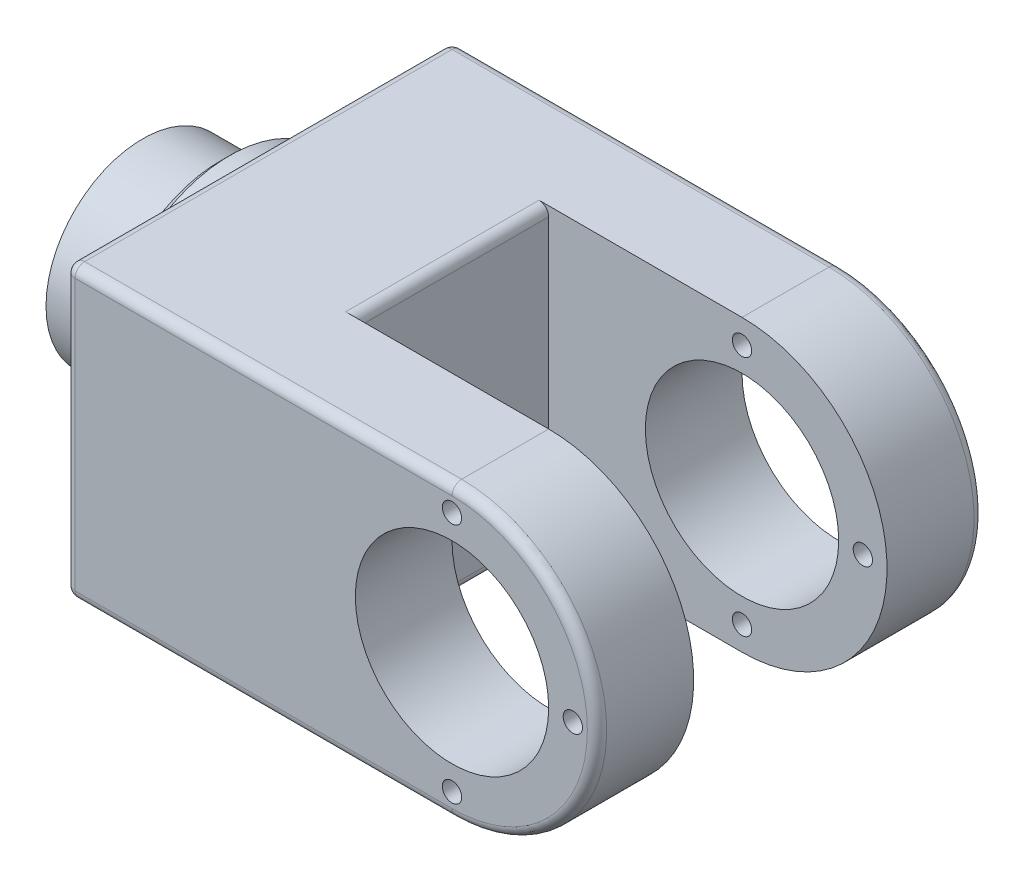
ISO-10303-21;
HEADER;
FILE_DESCRIPTION(('STEP AP214'),'2;1');
FILE_NAME('part.step','',(''),(''),'','','');
FILE_SCHEMA(('AUTOMOTIVE_DESIGN { 1 0 10303 214 1 1 1 1 }'));
ENDSEC;
DATA;
#1=APPLICATION_CONTEXT('core data for automotive mechanical design processes');
#2=APPLICATION_PROTOCOL_DEFINITION('international standard','automotive_design',2000,#1);
#3=PRODUCT_CONTEXT('',#1,'mechanical');
#4=PRODUCT('Part','Part','',(#3));
#5=PRODUCT_RELATED_PRODUCT_CATEGORY('part','',(#4));
#6=PRODUCT_DEFINITION_FORMATION('','',#4);
#7=PRODUCT_DEFINITION_CONTEXT('part definition',#1,'design');
#8=PRODUCT_DEFINITION('design','',#6,#7);
#9=PRODUCT_DEFINITION_SHAPE('','',#8);
#10=(LENGTH_UNIT() NAMED_UNIT(*) SI_UNIT(.MILLI.,.METRE.));
#11=(NAMED_UNIT(*) PLANE_ANGLE_UNIT() SI_UNIT($,.RADIAN.));
#12=(NAMED_UNIT(*) SI_UNIT($,.STERADIAN.) SOLID_ANGLE_UNIT());
#13=UNCERTAINTY_MEASURE_WITH_UNIT(LENGTH_MEASURE(1.E-05),#10,'distance_accuracy_value','');
#14=(GEOMETRIC_REPRESENTATION_CONTEXT(3) GLOBAL_UNCERTAINTY_ASSIGNED_CONTEXT((#13)) GLOBAL_UNIT_ASSIGNED_CONTEXT((#10,
#11,#12)) REPRESENTATION_CONTEXT('',''));
#15=CARTESIAN_POINT('',(0.,0.,0.));
#16=DIRECTION('',(0.,0.,1.));
#17=DIRECTION('',(1.,0.,0.));
#18=AXIS2_PLACEMENT_3D('',#15,#16,#17);
#19=CARTESIAN_POINT('',(-200.,75.,100.));
#20=DIRECTION('',(1.,0.,0.));
#21=DIRECTION('',(0.,0.,-1.));
#22=AXIS2_PLACEMENT_3D('',#19,#20,#21);
#23=PLANE('',#22);
#24=CARTESIAN_POINT('',(-200.,0.,0.));
#25=DIRECTION('',(1.,0.,0.));
#26=DIRECTION('',(0.,0.,-1.));
#27=AXIS2_PLACEMENT_3D('',#24,#25,#26);
#28=CIRCLE('',#27,70.);
#29=CARTESIAN_POINT('',(-200.,-70.,0.));
#30=VERTEX_POINT('',#29);
#31=CARTESIAN_POINT('',(-200.,0.,-70.));
#32=VERTEX_POINT('',#31);
#33=EDGE_CURVE('E264',#30,#32,#28,.T.);
#34=ORIENTED_EDGE('',*,*,#33,.T.);
#35=CARTESIAN_POINT('',(-200.,0.,0.));
#36=DIRECTION('',(1.,0.,0.));
#37=DIRECTION('',(0.,0.,-1.));
#38=AXIS2_PLACEMENT_3D('',#35,#36,#37);
#39=CIRCLE('',#38,70.);
#40=CARTESIAN_POINT('',(-200.,70.,0.));
#41=VERTEX_POINT('',#40);
#42=EDGE_CURVE('E266',#32,#41,#39,.T.);
#43=ORIENTED_EDGE('',*,*,#42,.T.);
#44=DIRECTION('',(0.,0.,-1.));
#45=VECTOR('',#44,1.);
#46=CARTESIAN_POINT('',(-200.,70.,100.));
#47=LINE('',#46,#45);
#48=CARTESIAN_POINT('',(-200.,70.,-95.));
#49=VERTEX_POINT('',#48);
#50=EDGE_CURVE('E262',#41,#49,#47,.T.);
#51=ORIENTED_EDGE('',*,*,#50,.T.);
#52=DIRECTION('',(0.,-1.,0.));
#53=VECTOR('',#52,1.);
#54=CARTESIAN_POINT('',(-200.,75.,-95.));
#55=LINE('',#54,#53);
#56=CARTESIAN_POINT('',(-200.,-70.,-95.));
#57=VERTEX_POINT('',#56);
#58=EDGE_CURVE('E260',#49,#57,#55,.T.);
#59=ORIENTED_EDGE('',*,*,#58,.T.);
#60=DIRECTION('',(0.,0.,-1.));
#61=VECTOR('',#60,1.);
#62=CARTESIAN_POINT('',(-200.,-70.,100.));
#63=LINE('',#62,#61);
#64=EDGE_CURVE('E254',#57,#30,#63,.F.);
#65=ORIENTED_EDGE('',*,*,#64,.T.);
#66=EDGE_LOOP('',(#34,#43,#51,#59,#65));
#67=FACE_BOUND('',#66,.T.);
#68=ADVANCED_FACE('F34',(#67),#23,.F.);
#69=CARTESIAN_POINT('',(0.,0.,100.));
#70=DIRECTION('',(0.,0.,-1.));
#71=DIRECTION('',(-1.,0.,0.));
#72=AXIS2_PLACEMENT_3D('',#69,#70,#71);
#73=CYLINDRICAL_SURFACE('',#72,75.);
#74=DIRECTION('',(0.,0.,-1.));
#75=VECTOR('',#74,1.);
#76=CARTESIAN_POINT('',(0.,-75.,100.));
#77=LINE('',#76,#75);
#78=CARTESIAN_POINT('',(0.,-75.,-50.));
#79=VERTEX_POINT('',#78);
#80=CARTESIAN_POINT('',(0.,-75.,-95.));
#81=VERTEX_POINT('',#80);
#82=EDGE_CURVE('E184',#79,#81,#77,.T.);
#83=ORIENTED_EDGE('',*,*,#82,.T.);
#84=CARTESIAN_POINT('',(0.,0.,-95.));
#85=DIRECTION('',(0.,0.,1.));
#86=DIRECTION('',(1.,0.,0.));
#87=AXIS2_PLACEMENT_3D('',#84,#85,#86);
#88=CIRCLE('',#87,75.);
#89=CARTESIAN_POINT('',(0.,75.,-95.));
#90=VERTEX_POINT('',#89);
#91=EDGE_CURVE('E179',#81,#90,#88,.T.);
#92=ORIENTED_EDGE('',*,*,#91,.T.);
#93=DIRECTION('',(0.,0.,-1.));
#94=VECTOR('',#93,1.);
#95=CARTESIAN_POINT('',(0.,75.,100.));
#96=LINE('',#95,#94);
#97=CARTESIAN_POINT('',(0.,75.,-50.));
#98=VERTEX_POINT('',#97);
#99=EDGE_CURVE('E171',#98,#90,#96,.T.);
#100=ORIENTED_EDGE('',*,*,#99,.F.);
#101=CARTESIAN_POINT('',(0.,0.,-50.));
#102=DIRECTION('',(0.,0.,1.));
#103=DIRECTION('',(1.,0.,0.));
#104=AXIS2_PLACEMENT_3D('',#101,#102,#103);
#105=CIRCLE('',#104,75.);
#106=EDGE_CURVE('E155',#79,#98,#105,.T.);
#107=ORIENTED_EDGE('',*,*,#106,.F.);
#108=EDGE_LOOP('',(#83,#92,#100,#107));
#109=FACE_BOUND('',#108,.T.);
#110=ADVANCED_FACE('F177',(#109),#73,.T.);
#111=CARTESIAN_POINT('',(0.,75.,100.));
#112=DIRECTION('',(0.,-1.,0.));
#113=DIRECTION('',(1.,0.,0.));
#114=AXIS2_PLACEMENT_3D('',#111,#112,#113);
#115=PLANE('',#114);
#116=DIRECTION('',(-1.,0.,0.));
#117=VECTOR('',#116,1.);
#118=CARTESIAN_POINT('',(0.,75.,50.));
#119=LINE('',#118,#117);
#120=CARTESIAN_POINT('',(0.,75.,50.));
#121=VERTEX_POINT('',#120);
#122=CARTESIAN_POINT('',(-105.,75.,50.));
#123=VERTEX_POINT('',#122);
#124=EDGE_CURVE('E364',#121,#123,#119,.T.);
#125=ORIENTED_EDGE('',*,*,#124,.T.);
#126=DIRECTION('',(0.,0.,1.));
#127=VECTOR('',#126,1.);
#128=CARTESIAN_POINT('',(-105.,75.,100.));
#129=LINE('',#128,#127);
#130=CARTESIAN_POINT('',(-105.,75.,-50.));
#131=VERTEX_POINT('',#130);
#132=EDGE_CURVE('E174',#123,#131,#129,.F.);
#133=ORIENTED_EDGE('',*,*,#132,.T.);
#134=DIRECTION('',(-1.,0.,0.));
#135=VECTOR('',#134,1.);
#136=CARTESIAN_POINT('',(0.,75.,-50.));
#137=LINE('',#136,#135);
#138=EDGE_CURVE('E158',#98,#131,#137,.T.);
#139=ORIENTED_EDGE('',*,*,#138,.F.);
#140=ORIENTED_EDGE('',*,*,#99,.T.);
#141=DIRECTION('',(-1.,0.,0.));
#142=VECTOR('',#141,1.);
#143=CARTESIAN_POINT('',(0.,75.,-95.));
#144=LINE('',#143,#142);
#145=CARTESIAN_POINT('',(-195.,75.,-95.));
#146=VERTEX_POINT('',#145);
#147=EDGE_CURVE('E273',#90,#146,#144,.T.);
#148=ORIENTED_EDGE('',*,*,#147,.T.);
#149=DIRECTION('',(0.,0.,-1.));
#150=VECTOR('',#149,1.);
#151=CARTESIAN_POINT('',(-195.,75.,100.));
#152=LINE('',#151,#150);
#153=CARTESIAN_POINT('',(-195.,75.,95.));
#154=VERTEX_POINT('',#153);
#155=EDGE_CURVE('E271',#146,#154,#152,.F.);
#156=ORIENTED_EDGE('',*,*,#155,.T.);
#157=DIRECTION('',(-1.,0.,0.));
#158=VECTOR('',#157,1.);
#159=CARTESIAN_POINT('',(0.,75.,95.));
#160=LINE('',#159,#158);
#161=CARTESIAN_POINT('',(0.,75.,95.));
#162=VERTEX_POINT('',#161);
#163=EDGE_CURVE('E269',#154,#162,#160,.F.);
#164=ORIENTED_EDGE('',*,*,#163,.T.);
#165=EDGE_CURVE('E180',#162,#121,#96,.T.);
#166=ORIENTED_EDGE('',*,*,#165,.T.);
#167=EDGE_LOOP('',(#125,#133,#139,#140,#148,#156,#164,#166));
#168=FACE_BOUND('',#167,.T.);
#169=ADVANCED_FACE('F170',(#168),#115,.F.);
#170=CARTESIAN_POINT('',(-200.,-75.,100.));
#171=DIRECTION('',(0.,1.,0.));
#172=DIRECTION('',(0.,0.,1.));
#173=AXIS2_PLACEMENT_3D('',#170,#171,#172);
#174=PLANE('',#173);
#175=DIRECTION('',(0.,0.,-1.));
#176=VECTOR('',#175,1.);
#177=CARTESIAN_POINT('',(-195.,-75.,100.));
#178=LINE('',#177,#176);
#179=CARTESIAN_POINT('',(-195.,-75.,95.));
#180=VERTEX_POINT('',#179);
#181=CARTESIAN_POINT('',(-195.,-75.,-95.));
#182=VERTEX_POINT('',#181);
#183=EDGE_CURVE('E210',#180,#182,#178,.T.);
#184=ORIENTED_EDGE('',*,*,#183,.T.);
#185=DIRECTION('',(1.,0.,0.));
#186=VECTOR('',#185,1.);
#187=CARTESIAN_POINT('',(-200.,-75.,-95.));
#188=LINE('',#187,#186);
#189=EDGE_CURVE('E214',#182,#81,#188,.T.);
#190=ORIENTED_EDGE('',*,*,#189,.T.);
#191=ORIENTED_EDGE('',*,*,#82,.F.);
#192=DIRECTION('',(1.,0.,0.));
#193=VECTOR('',#192,1.);
#194=CARTESIAN_POINT('',(-100.,-75.,-50.));
#195=LINE('',#194,#193);
#196=CARTESIAN_POINT('',(-105.,-75.,-50.));
#197=VERTEX_POINT('',#196);
#198=EDGE_CURVE('E161',#197,#79,#195,.T.);
#199=ORIENTED_EDGE('',*,*,#198,.F.);
#200=DIRECTION('',(0.,0.,1.));
#201=VECTOR('',#200,1.);
#202=CARTESIAN_POINT('',(-105.,-75.,100.));
#203=LINE('',#202,#201);
#204=CARTESIAN_POINT('',(-105.,-75.,50.));
#205=VERTEX_POINT('',#204);
#206=EDGE_CURVE('E193',#197,#205,#203,.T.);
#207=ORIENTED_EDGE('',*,*,#206,.T.);
#208=DIRECTION('',(1.,0.,0.));
#209=VECTOR('',#208,1.);
#210=CARTESIAN_POINT('',(-100.,-75.,50.));
#211=LINE('',#210,#209);
#212=CARTESIAN_POINT('',(0.,-75.,50.));
#213=VERTEX_POINT('',#212);
#214=EDGE_CURVE('E166',#205,#213,#211,.T.);
#215=ORIENTED_EDGE('',*,*,#214,.T.);
#216=CARTESIAN_POINT('',(0.,-75.,95.));
#217=VERTEX_POINT('',#216);
#218=EDGE_CURVE('E181',#217,#213,#77,.T.);
#219=ORIENTED_EDGE('',*,*,#218,.F.);
#220=DIRECTION('',(1.,0.,0.));
#221=VECTOR('',#220,1.);
#222=CARTESIAN_POINT('',(-200.,-75.,95.));
#223=LINE('',#222,#221);
#224=EDGE_CURVE('E212',#217,#180,#223,.F.);
#225=ORIENTED_EDGE('',*,*,#224,.T.);
#226=EDGE_LOOP('',(#184,#190,#191,#199,#207,#215,#219,#225));
#227=FACE_BOUND('',#226,.T.);
#228=ADVANCED_FACE('F370',(#227),#174,.F.);
#229=ORIENTED_EDGE('',*,*,#165,.F.);
#230=CARTESIAN_POINT('',(0.,0.,95.));
#231=DIRECTION('',(0.,0.,1.));
#232=DIRECTION('',(1.,0.,0.));
#233=AXIS2_PLACEMENT_3D('',#230,#231,#232);
#234=CIRCLE('',#233,75.);
#235=EDGE_CURVE('E236',#162,#217,#234,.F.);
#236=ORIENTED_EDGE('',*,*,#235,.T.);
#237=ORIENTED_EDGE('',*,*,#218,.T.);
#238=CARTESIAN_POINT('',(0.,0.,50.));
#239=DIRECTION('',(0.,0.,1.));
#240=DIRECTION('',(1.,0.,0.));
#241=AXIS2_PLACEMENT_3D('',#238,#239,#240);
#242=CIRCLE('',#241,75.);
#243=EDGE_CURVE('E358',#213,#121,#242,.T.);
#244=ORIENTED_EDGE('',*,*,#243,.T.);
#245=EDGE_LOOP('',(#229,#236,#237,#244));
#246=FACE_BOUND('',#245,.T.);
#247=ADVANCED_FACE('F387',(#246),#73,.T.);
#248=DIRECTION('',(0.,0.,-1.));
#249=VECTOR('',#248,1.);
#250=CARTESIAN_POINT('',(-200.,70.,100.));
#251=LINE('',#250,#249);
#252=CARTESIAN_POINT('',(-200.,70.,95.));
#253=VERTEX_POINT('',#252);
#254=EDGE_CURVE('E249',#253,#41,#251,.T.);
#255=ORIENTED_EDGE('',*,*,#254,.T.);
#256=CARTESIAN_POINT('',(-200.,0.,0.));
#257=DIRECTION('',(1.,0.,0.));
#258=DIRECTION('',(0.,0.,-1.));
#259=AXIS2_PLACEMENT_3D('',#256,#257,#258);
#260=CIRCLE('',#259,70.);
#261=EDGE_CURVE('E257',#41,#30,#260,.T.);
#262=ORIENTED_EDGE('',*,*,#261,.T.);
#263=DIRECTION('',(0.,0.,-1.));
#264=VECTOR('',#263,1.);
#265=CARTESIAN_POINT('',(-200.,-70.,100.));
#266=LINE('',#265,#264);
#267=CARTESIAN_POINT('',(-200.,-70.,95.));
#268=VERTEX_POINT('',#267);
#269=EDGE_CURVE('E252',#30,#268,#266,.F.);
#270=ORIENTED_EDGE('',*,*,#269,.T.);
#271=DIRECTION('',(0.,-1.,0.));
#272=VECTOR('',#271,1.);
#273=CARTESIAN_POINT('',(-200.,75.,95.));
#274=LINE('',#273,#272);
#275=EDGE_CURVE('E247',#268,#253,#274,.F.);
#276=ORIENTED_EDGE('',*,*,#275,.T.);
#277=EDGE_LOOP('',(#255,#262,#270,#276));
#278=FACE_BOUND('',#277,.T.);
#279=ADVANCED_FACE('F436',(#278),#23,.F.);
#280=CARTESIAN_POINT('',(0.,0.,100.));
#281=DIRECTION('',(0.,0.,1.));
#282=DIRECTION('',(1.,0.,0.));
#283=AXIS2_PLACEMENT_3D('',#280,#281,#282);
#284=PLANE('',#283);
#285=CARTESIAN_POINT('',(0.,0.,100.));
#286=DIRECTION('',(0.,0.,1.));
#287=DIRECTION('',(1.,0.,0.));
#288=AXIS2_PLACEMENT_3D('',#285,#286,#287);
#289=CIRCLE('',#288,50.);
#290=CARTESIAN_POINT('',(50.,0.,100.));
#291=VERTEX_POINT('',#290);
#292=EDGE_CURVE('E915',#291,#291,#289,.T.);
#293=ORIENTED_EDGE('',*,*,#292,.F.);
#294=EDGE_LOOP('',(#293));
#295=FACE_BOUND('',#294,.T.);
#296=DIRECTION('',(0.,-1.,0.));
#297=VECTOR('',#296,1.);
#298=CARTESIAN_POINT('',(-195.,-75.,100.));
#299=LINE('',#298,#297);
#300=CARTESIAN_POINT('',(-195.,70.,100.));
#301=VERTEX_POINT('',#300);
#302=CARTESIAN_POINT('',(-195.,-70.,100.));
#303=VERTEX_POINT('',#302);
#304=EDGE_CURVE('E229',#301,#303,#299,.T.);
#305=ORIENTED_EDGE('',*,*,#304,.T.);
#306=DIRECTION('',(1.,0.,0.));
#307=VECTOR('',#306,1.);
#308=CARTESIAN_POINT('',(0.,-70.,100.));
#309=LINE('',#308,#307);
#310=CARTESIAN_POINT('',(0.,-70.,100.));
#311=VERTEX_POINT('',#310);
#312=EDGE_CURVE('E233',#303,#311,#309,.T.);
#313=ORIENTED_EDGE('',*,*,#312,.T.);
#314=CARTESIAN_POINT('',(0.,0.,100.));
#315=DIRECTION('',(0.,0.,1.));
#316=DIRECTION('',(1.,0.,0.));
#317=AXIS2_PLACEMENT_3D('',#314,#315,#316);
#318=CIRCLE('',#317,70.);
#319=CARTESIAN_POINT('',(0.,70.,100.));
#320=VERTEX_POINT('',#319);
#321=EDGE_CURVE('E231',#311,#320,#318,.T.);
#322=ORIENTED_EDGE('',*,*,#321,.T.);
#323=DIRECTION('',(-1.,0.,0.));
#324=VECTOR('',#323,1.);
#325=CARTESIAN_POINT('',(-200.,70.,100.));
#326=LINE('',#325,#324);
#327=EDGE_CURVE('E227',#320,#301,#326,.T.);
#328=ORIENTED_EDGE('',*,*,#327,.T.);
#329=EDGE_LOOP('',(#305,#313,#322,#328));
#330=FACE_BOUND('',#329,.T.);
#331=CARTESIAN_POINT('',(62.5000000000035,-2.29698647419702E-13,100.));
#332=DIRECTION('',(0.,0.,1.));
#333=DIRECTION('',(1.,0.,0.));
#334=AXIS2_PLACEMENT_3D('',#331,#332,#333);
#335=CIRCLE('',#334,4.99999999999895);
#336=CARTESIAN_POINT('',(67.5000000000025,-2.29698647419702E-13,100.));
#337=VERTEX_POINT('',#336);
#338=EDGE_CURVE('E203',#337,#337,#335,.T.);
#339=ORIENTED_EDGE('',*,*,#338,.F.);
#340=EDGE_LOOP('',(#339));
#341=FACE_BOUND('',#340,.T.);
#342=CARTESIAN_POINT('',(-4.36435167355392E-13,-62.5,100.));
#343=DIRECTION('',(0.,0.,1.));
#344=DIRECTION('',(1.,0.,0.));
#345=AXIS2_PLACEMENT_3D('',#342,#343,#344);
#346=CIRCLE('',#345,5.);
#347=CARTESIAN_POINT('',(4.99999999999957,-62.5,100.));
#348=VERTEX_POINT('',#347);
#349=EDGE_CURVE('E336',#348,#348,#346,.T.);
#350=ORIENTED_EDGE('',*,*,#349,.F.);
#351=EDGE_LOOP('',(#350));
#352=FACE_BOUND('',#351,.T.);
#353=CARTESIAN_POINT('',(0.,62.5,100.));
#354=DIRECTION('',(0.,0.,1.));
#355=DIRECTION('',(1.,0.,0.));
#356=AXIS2_PLACEMENT_3D('',#353,#354,#355);
#357=CIRCLE('',#356,5.);
#358=CARTESIAN_POINT('',(5.,62.5,100.));
#359=VERTEX_POINT('',#358);
#360=EDGE_CURVE('E349',#359,#359,#357,.T.);
#361=ORIENTED_EDGE('',*,*,#360,.F.);
#362=EDGE_LOOP('',(#361));
#363=FACE_BOUND('',#362,.T.);
#364=ADVANCED_FACE('F450',(#295,#330,#341,#352,#363),#284,.T.);
#365=CARTESIAN_POINT('',(0.,0.,-100.));
#366=DIRECTION('',(0.,0.,1.));
#367=DIRECTION('',(1.,0.,0.));
#368=AXIS2_PLACEMENT_3D('',#365,#366,#367);
#369=PLANE('',#368);
#370=CARTESIAN_POINT('',(0.,0.,-100.));
#371=DIRECTION('',(0.,0.,1.));
#372=DIRECTION('',(1.,0.,0.));
#373=AXIS2_PLACEMENT_3D('',#370,#371,#372);
#374=CIRCLE('',#373,50.);
#375=CARTESIAN_POINT('',(50.,0.,-100.));
#376=VERTEX_POINT('',#375);
#377=EDGE_CURVE('E918',#376,#376,#374,.T.);
#378=ORIENTED_EDGE('',*,*,#377,.T.);
#379=EDGE_LOOP('',(#378));
#380=FACE_BOUND('',#379,.T.);
#381=CARTESIAN_POINT('',(0.,0.,-100.));
#382=DIRECTION('',(0.,0.,1.));
#383=DIRECTION('',(1.,0.,0.));
#384=AXIS2_PLACEMENT_3D('',#381,#382,#383);
#385=CIRCLE('',#384,70.);
#386=CARTESIAN_POINT('',(0.,70.,-100.));
#387=VERTEX_POINT('',#386);
#388=CARTESIAN_POINT('',(0.,-70.,-100.));
#389=VERTEX_POINT('',#388);
#390=EDGE_CURVE('E221',#387,#389,#385,.F.);
#391=ORIENTED_EDGE('',*,*,#390,.T.);
#392=DIRECTION('',(1.,0.,0.));
#393=VECTOR('',#392,1.);
#394=CARTESIAN_POINT('',(0.,-70.,-100.));
#395=LINE('',#394,#393);
#396=CARTESIAN_POINT('',(-195.,-70.,-100.));
#397=VERTEX_POINT('',#396);
#398=EDGE_CURVE('E223',#389,#397,#395,.F.);
#399=ORIENTED_EDGE('',*,*,#398,.T.);
#400=DIRECTION('',(0.,-1.,0.));
#401=VECTOR('',#400,1.);
#402=CARTESIAN_POINT('',(-195.,0.,-100.));
#403=LINE('',#402,#401);
#404=CARTESIAN_POINT('',(-195.,70.,-100.));
#405=VERTEX_POINT('',#404);
#406=EDGE_CURVE('E219',#397,#405,#403,.F.);
#407=ORIENTED_EDGE('',*,*,#406,.T.);
#408=DIRECTION('',(-1.,0.,0.));
#409=VECTOR('',#408,1.);
#410=CARTESIAN_POINT('',(0.,70.,-100.));
#411=LINE('',#410,#409);
#412=EDGE_CURVE('E217',#405,#387,#411,.F.);
#413=ORIENTED_EDGE('',*,*,#412,.T.);
#414=EDGE_LOOP('',(#391,#399,#407,#413));
#415=FACE_BOUND('',#414,.T.);
#416=CARTESIAN_POINT('',(62.5000000000035,-2.29698647419702E-13,-100.));
#417=DIRECTION('',(0.,0.,1.));
#418=DIRECTION('',(1.,0.,0.));
#419=AXIS2_PLACEMENT_3D('',#416,#417,#418);
#420=CIRCLE('',#419,4.99999999999895);
#421=CARTESIAN_POINT('',(67.5000000000025,-2.29698647419702E-13,-100.));
#422=VERTEX_POINT('',#421);
#423=EDGE_CURVE('E341',#422,#422,#420,.T.);
#424=ORIENTED_EDGE('',*,*,#423,.T.);
#425=EDGE_LOOP('',(#424));
#426=FACE_BOUND('',#425,.T.);
#427=CARTESIAN_POINT('',(-4.36435167355392E-13,-62.5,-100.));
#428=DIRECTION('',(0.,0.,1.));
#429=DIRECTION('',(1.,0.,0.));
#430=AXIS2_PLACEMENT_3D('',#427,#428,#429);
#431=CIRCLE('',#430,5.);
#432=CARTESIAN_POINT('',(4.99999999999957,-62.5,-100.));
#433=VERTEX_POINT('',#432);
#434=EDGE_CURVE('E330',#433,#433,#431,.T.);
#435=ORIENTED_EDGE('',*,*,#434,.T.);
#436=EDGE_LOOP('',(#435));
#437=FACE_BOUND('',#436,.T.);
#438=CARTESIAN_POINT('',(0.,62.5,-100.));
#439=DIRECTION('',(0.,0.,1.));
#440=DIRECTION('',(1.,0.,0.));
#441=AXIS2_PLACEMENT_3D('',#438,#439,#440);
#442=CIRCLE('',#441,5.);
#443=CARTESIAN_POINT('',(5.,62.5,-100.));
#444=VERTEX_POINT('',#443);
#445=EDGE_CURVE('E198',#444,#444,#442,.T.);
#446=ORIENTED_EDGE('',*,*,#445,.T.);
#447=EDGE_LOOP('',(#446));
#448=FACE_BOUND('',#447,.T.);
#449=ADVANCED_FACE('F475',(#380,#415,#426,#437,#448),#369,.F.);
#450=CARTESIAN_POINT('',(-100.,75.,-50.));
#451=DIRECTION('',(-1.,0.,0.));
#452=DIRECTION('',(0.,0.,1.));
#453=AXIS2_PLACEMENT_3D('',#450,#451,#452);
#454=PLANE('',#453);
#455=DIRECTION('',(0.,-1.,0.));
#456=VECTOR('',#455,1.);
#457=CARTESIAN_POINT('',(-100.,75.,50.));
#458=LINE('',#457,#456);
#459=CARTESIAN_POINT('',(-100.,70.,50.));
#460=VERTEX_POINT('',#459);
#461=CARTESIAN_POINT('',(-100.,-70.,50.));
#462=VERTEX_POINT('',#461);
#463=EDGE_CURVE('E366',#460,#462,#458,.T.);
#464=ORIENTED_EDGE('',*,*,#463,.T.);
#465=DIRECTION('',(0.,0.,1.));
#466=VECTOR('',#465,1.);
#467=CARTESIAN_POINT('',(-100.,-70.,-50.));
#468=LINE('',#467,#466);
#469=CARTESIAN_POINT('',(-100.,-70.,-50.));
#470=VERTEX_POINT('',#469);
#471=EDGE_CURVE('E51',#462,#470,#468,.F.);
#472=ORIENTED_EDGE('',*,*,#471,.T.);
#473=DIRECTION('',(0.,-1.,0.));
#474=VECTOR('',#473,1.);
#475=CARTESIAN_POINT('',(-100.,75.,-50.));
#476=LINE('',#475,#474);
#477=CARTESIAN_POINT('',(-100.,70.,-50.));
#478=VERTEX_POINT('',#477);
#479=EDGE_CURVE('E175',#478,#470,#476,.T.);
#480=ORIENTED_EDGE('',*,*,#479,.F.);
#481=DIRECTION('',(0.,0.,1.));
#482=VECTOR('',#481,1.);
#483=CARTESIAN_POINT('',(-100.,70.,-50.));
#484=LINE('',#483,#482);
#485=EDGE_CURVE('E276',#478,#460,#484,.T.);
#486=ORIENTED_EDGE('',*,*,#485,.T.);
#487=EDGE_LOOP('',(#464,#472,#480,#486));
#488=FACE_BOUND('',#487,.T.);
#489=ADVANCED_FACE('F383',(#488),#454,.F.);
#490=CARTESIAN_POINT('',(0.,0.,-50.));
#491=DIRECTION('',(0.,0.,1.));
#492=DIRECTION('',(1.,0.,0.));
#493=AXIS2_PLACEMENT_3D('',#490,#491,#492);
#494=PLANE('',#493);
#495=CARTESIAN_POINT('',(0.,0.,-50.));
#496=DIRECTION('',(0.,0.,1.));
#497=DIRECTION('',(1.,0.,0.));
#498=AXIS2_PLACEMENT_3D('',#495,#496,#497);
#499=CIRCLE('',#498,50.);
#500=CARTESIAN_POINT('',(50.,0.,-50.));
#501=VERTEX_POINT('',#500);
#502=EDGE_CURVE('E289',#501,#501,#499,.T.);
#503=ORIENTED_EDGE('',*,*,#502,.F.);
#504=EDGE_LOOP('',(#503));
#505=FACE_BOUND('',#504,.T.);
#506=CARTESIAN_POINT('',(62.5000000000035,-2.29698647419702E-13,-50.));
#507=DIRECTION('',(0.,0.,1.));
#508=DIRECTION('',(1.,0.,0.));
#509=AXIS2_PLACEMENT_3D('',#506,#507,#508);
#510=CIRCLE('',#509,4.99999999999895);
#511=CARTESIAN_POINT('',(67.5000000000025,-2.29698647419702E-13,-50.));
#512=VERTEX_POINT('',#511);
#513=EDGE_CURVE('E207',#512,#512,#510,.T.);
#514=ORIENTED_EDGE('',*,*,#513,.F.);
#515=EDGE_LOOP('',(#514));
#516=FACE_BOUND('',#515,.T.);
#517=CARTESIAN_POINT('',(-4.36435167355392E-13,-62.5,-50.));
#518=DIRECTION('',(0.,0.,1.));
#519=DIRECTION('',(1.,0.,0.));
#520=AXIS2_PLACEMENT_3D('',#517,#518,#519);
#521=CIRCLE('',#520,5.);
#522=CARTESIAN_POINT('',(4.99999999999957,-62.5,-50.));
#523=VERTEX_POINT('',#522);
#524=EDGE_CURVE('E202',#523,#523,#521,.T.);
#525=ORIENTED_EDGE('',*,*,#524,.F.);
#526=EDGE_LOOP('',(#525));
#527=FACE_BOUND('',#526,.T.);
#528=CARTESIAN_POINT('',(0.,62.5,-50.));
#529=DIRECTION('',(0.,0.,1.));
#530=DIRECTION('',(1.,0.,0.));
#531=AXIS2_PLACEMENT_3D('',#528,#529,#530);
#532=CIRCLE('',#531,5.);
#533=CARTESIAN_POINT('',(5.,62.5,-50.));
#534=VERTEX_POINT('',#533);
#535=EDGE_CURVE('E197',#534,#534,#532,.T.);
#536=ORIENTED_EDGE('',*,*,#535,.F.);
#537=EDGE_LOOP('',(#536));
#538=FACE_BOUND('',#537,.T.);
#539=ORIENTED_EDGE('',*,*,#106,.T.);
#540=ORIENTED_EDGE('',*,*,#138,.T.);
#541=CARTESIAN_POINT('',(-105.,70.,-50.));
#542=DIRECTION('',(0.,0.,1.));
#543=DIRECTION('',(1.,0.,0.));
#544=AXIS2_PLACEMENT_3D('',#541,#542,#543);
#545=CIRCLE('',#544,5.);
#546=EDGE_CURVE('E11',#131,#478,#545,.F.);
#547=ORIENTED_EDGE('',*,*,#546,.T.);
#548=ORIENTED_EDGE('',*,*,#479,.T.);
#549=CARTESIAN_POINT('',(-105.,-70.,-50.));
#550=DIRECTION('',(0.,0.,1.));
#551=DIRECTION('',(1.,0.,0.));
#552=AXIS2_PLACEMENT_3D('',#549,#550,#551);
#553=CIRCLE('',#552,5.);
#554=EDGE_CURVE('E282',#470,#197,#553,.F.);
#555=ORIENTED_EDGE('',*,*,#554,.T.);
#556=ORIENTED_EDGE('',*,*,#198,.T.);
#557=EDGE_LOOP('',(#539,#540,#547,#548,#555,#556));
#558=FACE_BOUND('',#557,.T.);
#559=ADVANCED_FACE('F157',(#505,#516,#527,#538,#558),#494,.T.);
#560=CARTESIAN_POINT('',(0.,0.,50.));
#561=DIRECTION('',(0.,0.,1.));
#562=DIRECTION('',(1.,0.,0.));
#563=AXIS2_PLACEMENT_3D('',#560,#561,#562);
#564=PLANE('',#563);
#565=CARTESIAN_POINT('',(0.,0.,50.));
#566=DIRECTION('',(0.,0.,1.));
#567=DIRECTION('',(1.,0.,0.));
#568=AXIS2_PLACEMENT_3D('',#565,#566,#567);
#569=CIRCLE('',#568,50.);
#570=CARTESIAN_POINT('',(50.,0.,50.));
#571=VERTEX_POINT('',#570);
#572=EDGE_CURVE('E38',#571,#571,#569,.T.);
#573=ORIENTED_EDGE('',*,*,#572,.T.);
#574=EDGE_LOOP('',(#573));
#575=FACE_BOUND('',#574,.T.);
#576=CARTESIAN_POINT('',(62.5000000000035,-2.29698647419702E-13,50.));
#577=DIRECTION('',(0.,0.,1.));
#578=DIRECTION('',(1.,0.,0.));
#579=AXIS2_PLACEMENT_3D('',#576,#577,#578);
#580=CIRCLE('',#579,4.99999999999895);
#581=CARTESIAN_POINT('',(67.5000000000025,-2.29698647419702E-13,50.));
#582=VERTEX_POINT('',#581);
#583=EDGE_CURVE('E204',#582,#582,#580,.T.);
#584=ORIENTED_EDGE('',*,*,#583,.T.);
#585=EDGE_LOOP('',(#584));
#586=FACE_BOUND('',#585,.T.);
#587=CARTESIAN_POINT('',(-4.36435167355392E-13,-62.5,50.));
#588=DIRECTION('',(0.,0.,1.));
#589=DIRECTION('',(1.,0.,0.));
#590=AXIS2_PLACEMENT_3D('',#587,#588,#589);
#591=CIRCLE('',#590,5.);
#592=CARTESIAN_POINT('',(4.99999999999957,-62.5,50.));
#593=VERTEX_POINT('',#592);
#594=EDGE_CURVE('E199',#593,#593,#591,.T.);
#595=ORIENTED_EDGE('',*,*,#594,.T.);
#596=EDGE_LOOP('',(#595));
#597=FACE_BOUND('',#596,.T.);
#598=CARTESIAN_POINT('',(0.,62.5,50.));
#599=DIRECTION('',(0.,0.,1.));
#600=DIRECTION('',(1.,0.,0.));
#601=AXIS2_PLACEMENT_3D('',#598,#599,#600);
#602=CIRCLE('',#601,5.);
#603=CARTESIAN_POINT('',(5.,62.5,50.));
#604=VERTEX_POINT('',#603);
#605=EDGE_CURVE('E194',#604,#604,#602,.T.);
#606=ORIENTED_EDGE('',*,*,#605,.T.);
#607=EDGE_LOOP('',(#606));
#608=FACE_BOUND('',#607,.T.);
#609=ORIENTED_EDGE('',*,*,#243,.F.);
#610=ORIENTED_EDGE('',*,*,#214,.F.);
#611=CARTESIAN_POINT('',(-105.,-70.,50.));
#612=DIRECTION('',(0.,0.,1.));
#613=DIRECTION('',(1.,0.,0.));
#614=AXIS2_PLACEMENT_3D('',#611,#612,#613);
#615=CIRCLE('',#614,5.);
#616=EDGE_CURVE('E280',#205,#462,#615,.T.);
#617=ORIENTED_EDGE('',*,*,#616,.T.);
#618=ORIENTED_EDGE('',*,*,#463,.F.);
#619=CARTESIAN_POINT('',(-105.,70.,50.));
#620=DIRECTION('',(0.,0.,1.));
#621=DIRECTION('',(1.,0.,0.));
#622=AXIS2_PLACEMENT_3D('',#619,#620,#621);
#623=CIRCLE('',#622,5.);
#624=EDGE_CURVE('E43',#460,#123,#623,.T.);
#625=ORIENTED_EDGE('',*,*,#624,.T.);
#626=ORIENTED_EDGE('',*,*,#124,.F.);
#627=EDGE_LOOP('',(#609,#610,#617,#618,#625,#626));
#628=FACE_BOUND('',#627,.T.);
#629=ADVANCED_FACE('F376',(#575,#586,#597,#608,#628),#564,.F.);
#630=CARTESIAN_POINT('',(-220.,0.,0.));
#631=DIRECTION('',(1.,0.,0.));
#632=DIRECTION('',(0.,0.,-1.));
#633=AXIS2_PLACEMENT_3D('',#630,#631,#632);
#634=CYLINDRICAL_SURFACE('',#633,65.);
#635=CARTESIAN_POINT('',(-205.,0.,0.));
#636=DIRECTION('',(1.,0.,0.));
#637=DIRECTION('',(0.,0.,-1.));
#638=AXIS2_PLACEMENT_3D('',#635,#636,#637);
#639=CIRCLE('',#638,65.);
#640=CARTESIAN_POINT('',(-205.,0.,-65.));
#641=VERTEX_POINT('',#640);
#642=EDGE_CURVE('E244',#641,#641,#639,.F.);
#643=ORIENTED_EDGE('',*,*,#642,.T.);
#644=EDGE_LOOP('',(#643));
#645=FACE_BOUND('',#644,.T.);
#646=CARTESIAN_POINT('',(-215.,0.,0.));
#647=DIRECTION('',(-1.,0.,0.));
#648=DIRECTION('',(0.,0.,1.));
#649=AXIS2_PLACEMENT_3D('',#646,#647,#648);
#650=CIRCLE('',#649,65.);
#651=CARTESIAN_POINT('',(-215.,0.,65.));
#652=VERTEX_POINT('',#651);
#653=EDGE_CURVE('E190',#652,#652,#650,.F.);
#654=ORIENTED_EDGE('',*,*,#653,.T.);
#655=EDGE_LOOP('',(#654));
#656=FACE_BOUND('',#655,.T.);
#657=ADVANCED_FACE('F588',(#645,#656),#634,.T.);
#658=CARTESIAN_POINT('',(-220.,0.,0.));
#659=DIRECTION('',(-1.,0.,0.));
#660=DIRECTION('',(0.,0.,1.));
#661=AXIS2_PLACEMENT_3D('',#658,#659,#660);
#662=PLANE('',#661);
#663=CARTESIAN_POINT('',(-220.,0.,0.));
#664=DIRECTION('',(-1.,0.,0.));
#665=DIRECTION('',(0.,0.,1.));
#666=AXIS2_PLACEMENT_3D('',#663,#664,#665);
#667=CIRCLE('',#666,55.);
#668=CARTESIAN_POINT('',(-220.,0.,55.));
#669=VERTEX_POINT('',#668);
#670=EDGE_CURVE('E241',#669,#669,#667,.F.);
#671=ORIENTED_EDGE('',*,*,#670,.T.);
#672=EDGE_LOOP('',(#671));
#673=FACE_BOUND('',#672,.T.);
#674=CARTESIAN_POINT('',(-220.,0.,0.));
#675=DIRECTION('',(-1.,0.,0.));
#676=DIRECTION('',(0.,0.,1.));
#677=AXIS2_PLACEMENT_3D('',#674,#675,#676);
#678=CIRCLE('',#677,60.0000000000001);
#679=CARTESIAN_POINT('',(-220.,0.,60.0000000000001));
#680=VERTEX_POINT('',#679);
#681=EDGE_CURVE('E183',#680,#680,#678,.T.);
#682=ORIENTED_EDGE('',*,*,#681,.T.);
#683=EDGE_LOOP('',(#682));
#684=FACE_BOUND('',#683,.T.);
#685=ADVANCED_FACE('F791',(#673,#684),#662,.T.);
#686=CARTESIAN_POINT('',(-260.,0.,0.));
#687=DIRECTION('',(1.,0.,0.));
#688=DIRECTION('',(0.,0.,-1.));
#689=AXIS2_PLACEMENT_3D('',#686,#687,#688);
#690=CYLINDRICAL_SURFACE('',#689,50.);
#691=CARTESIAN_POINT('',(-225.,0.,0.));
#692=DIRECTION('',(-1.,0.,0.));
#693=DIRECTION('',(0.,0.,1.));
#694=AXIS2_PLACEMENT_3D('',#691,#692,#693);
#695=CIRCLE('',#694,50.);
#696=CARTESIAN_POINT('',(-225.,0.,50.));
#697=VERTEX_POINT('',#696);
#698=EDGE_CURVE('E238',#697,#697,#695,.T.);
#699=ORIENTED_EDGE('',*,*,#698,.T.);
#700=EDGE_LOOP('',(#699));
#701=FACE_BOUND('',#700,.T.);
#702=CARTESIAN_POINT('',(-260.,0.,0.));
#703=DIRECTION('',(-1.,0.,0.));
#704=DIRECTION('',(0.,0.,1.));
#705=AXIS2_PLACEMENT_3D('',#702,#703,#704);
#706=CIRCLE('',#705,50.);
#707=CARTESIAN_POINT('',(-260.,0.,50.));
#708=VERTEX_POINT('',#707);
#709=EDGE_CURVE('E356',#708,#708,#706,.T.);
#710=ORIENTED_EDGE('',*,*,#709,.F.);
#711=EDGE_LOOP('',(#710));
#712=FACE_BOUND('',#711,.T.);
#713=ADVANCED_FACE('F783',(#701,#712),#690,.T.);
#714=CARTESIAN_POINT('',(-260.,0.,0.));
#715=DIRECTION('',(-1.,0.,0.));
#716=DIRECTION('',(0.,0.,1.));
#717=AXIS2_PLACEMENT_3D('',#714,#715,#716);
#718=PLANE('',#717);
#719=ORIENTED_EDGE('',*,*,#709,.T.);
#720=EDGE_LOOP('',(#719));
#721=FACE_BOUND('',#720,.T.);
#722=ADVANCED_FACE('F486',(#721),#718,.T.);
#723=CARTESIAN_POINT('',(-220.,0.,0.));
#724=DIRECTION('',(1.,0.,0.));
#725=DIRECTION('',(0.,0.,-1.));
#726=AXIS2_PLACEMENT_3D('',#723,#724,#725);
#727=CONICAL_SURFACE('',#726,60.0000000000001,0.78539816339744);
#728=ORIENTED_EDGE('',*,*,#653,.F.);
#729=EDGE_LOOP('',(#728));
#730=FACE_BOUND('',#729,.T.);
#731=ORIENTED_EDGE('',*,*,#681,.F.);
#732=EDGE_LOOP('',(#731));
#733=FACE_BOUND('',#732,.T.);
#734=ADVANCED_FACE('F482',(#730,#733),#727,.T.);
#735=CARTESIAN_POINT('',(0.,62.5,-100.));
#736=DIRECTION('',(0.,0.,1.));
#737=DIRECTION('',(1.,0.,0.));
#738=AXIS2_PLACEMENT_3D('',#735,#736,#737);
#739=CYLINDRICAL_SURFACE('',#738,5.);
#740=ORIENTED_EDGE('',*,*,#360,.T.);
#741=EDGE_LOOP('',(#740));
#742=FACE_BOUND('',#741,.T.);
#743=ORIENTED_EDGE('',*,*,#605,.F.);
#744=EDGE_LOOP('',(#743));
#745=FACE_BOUND('',#744,.T.);
#746=ADVANCED_FACE('F485',(#742,#745),#739,.F.);
#747=ORIENTED_EDGE('',*,*,#535,.T.);
#748=EDGE_LOOP('',(#747));
#749=FACE_BOUND('',#748,.T.);
#750=ORIENTED_EDGE('',*,*,#445,.F.);
#751=EDGE_LOOP('',(#750));
#752=FACE_BOUND('',#751,.T.);
#753=ADVANCED_FACE('F755',(#749,#752),#739,.F.);
#754=CARTESIAN_POINT('',(-4.36435167355392E-13,-62.5,-100.));
#755=DIRECTION('',(0.,0.,1.));
#756=DIRECTION('',(1.,0.,0.));
#757=AXIS2_PLACEMENT_3D('',#754,#755,#756);
#758=CYLINDRICAL_SURFACE('',#757,5.);
#759=ORIENTED_EDGE('',*,*,#349,.T.);
#760=EDGE_LOOP('',(#759));
#761=FACE_BOUND('',#760,.T.);
#762=ORIENTED_EDGE('',*,*,#594,.F.);
#763=EDGE_LOOP('',(#762));
#764=FACE_BOUND('',#763,.T.);
#765=ADVANCED_FACE('F741',(#761,#764),#758,.F.);
#766=CARTESIAN_POINT('',(62.5000000000035,-2.29698647419702E-13,-100.));
#767=DIRECTION('',(0.,0.,1.));
#768=DIRECTION('',(1.,0.,0.));
#769=AXIS2_PLACEMENT_3D('',#766,#767,#768);
#770=CYLINDRICAL_SURFACE('',#769,4.99999999999895);
#771=ORIENTED_EDGE('',*,*,#338,.T.);
#772=EDGE_LOOP('',(#771));
#773=FACE_BOUND('',#772,.T.);
#774=ORIENTED_EDGE('',*,*,#583,.F.);
#775=EDGE_LOOP('',(#774));
#776=FACE_BOUND('',#775,.T.);
#777=ADVANCED_FACE('F732',(#773,#776),#770,.F.);
#778=ORIENTED_EDGE('',*,*,#524,.T.);
#779=EDGE_LOOP('',(#778));
#780=FACE_BOUND('',#779,.T.);
#781=ORIENTED_EDGE('',*,*,#434,.F.);
#782=EDGE_LOOP('',(#781));
#783=FACE_BOUND('',#782,.T.);
#784=ADVANCED_FACE('F729',(#780,#783),#758,.F.);
#785=ORIENTED_EDGE('',*,*,#513,.T.);
#786=EDGE_LOOP('',(#785));
#787=FACE_BOUND('',#786,.T.);
#788=ORIENTED_EDGE('',*,*,#423,.F.);
#789=EDGE_LOOP('',(#788));
#790=FACE_BOUND('',#789,.T.);
#791=ADVANCED_FACE('F714',(#787,#790),#770,.F.);
#792=CARTESIAN_POINT('',(0.,70.,95.));
#793=DIRECTION('',(1.,0.,0.));
#794=DIRECTION('',(0.,1.,0.));
#795=AXIS2_PLACEMENT_3D('',#792,#793,#794);
#796=CYLINDRICAL_SURFACE('',#795,5.);
#797=CARTESIAN_POINT('',(-195.,70.,95.));
#798=DIRECTION('',(-1.,0.,0.));
#799=DIRECTION('',(0.,0.,1.));
#800=AXIS2_PLACEMENT_3D('',#797,#798,#799);
#801=CIRCLE('',#800,5.);
#802=EDGE_CURVE('E326',#301,#154,#801,.T.);
#803=ORIENTED_EDGE('',*,*,#802,.F.);
#804=ORIENTED_EDGE('',*,*,#327,.F.);
#805=CARTESIAN_POINT('',(0.,70.,95.));
#806=DIRECTION('',(1.,0.,0.));
#807=DIRECTION('',(0.,0.,-1.));
#808=AXIS2_PLACEMENT_3D('',#805,#806,#807);
#809=CIRCLE('',#808,5.);
#810=EDGE_CURVE('E328',#162,#320,#809,.T.);
#811=ORIENTED_EDGE('',*,*,#810,.F.);
#812=ORIENTED_EDGE('',*,*,#163,.F.);
#813=EDGE_LOOP('',(#803,#804,#811,#812));
#814=FACE_BOUND('',#813,.T.);
#815=ADVANCED_FACE('F448',(#814),#796,.T.);
#816=CARTESIAN_POINT('',(0.,0.,95.));
#817=DIRECTION('',(0.,0.,1.));
#818=DIRECTION('',(1.,0.,0.));
#819=AXIS2_PLACEMENT_3D('',#816,#817,#818);
#820=TOROIDAL_SURFACE('',#819,70.,5.);
#821=ORIENTED_EDGE('',*,*,#810,.T.);
#822=ORIENTED_EDGE('',*,*,#321,.F.);
#823=CARTESIAN_POINT('',(0.,-70.,95.));
#824=DIRECTION('',(-1.,0.,0.));
#825=DIRECTION('',(0.,0.,1.));
#826=AXIS2_PLACEMENT_3D('',#823,#824,#825);
#827=CIRCLE('',#826,5.);
#828=EDGE_CURVE('E321',#217,#311,#827,.T.);
#829=ORIENTED_EDGE('',*,*,#828,.F.);
#830=ORIENTED_EDGE('',*,*,#235,.F.);
#831=EDGE_LOOP('',(#821,#822,#829,#830));
#832=FACE_BOUND('',#831,.T.);
#833=ADVANCED_FACE('F388',(#832),#820,.T.);
#834=CARTESIAN_POINT('',(-195.,70.,95.));
#835=DIRECTION('',(0.,0.,1.));
#836=DIRECTION('',(1.,0.,0.));
#837=AXIS2_PLACEMENT_3D('',#834,#835,#836);
#838=SPHERICAL_SURFACE('',#837,5.);
#839=CARTESIAN_POINT('',(-195.,70.,95.));
#840=DIRECTION('',(0.,0.,1.));
#841=DIRECTION('',(1.,0.,0.));
#842=AXIS2_PLACEMENT_3D('',#839,#840,#841);
#843=CIRCLE('',#842,5.);
#844=EDGE_CURVE('E318',#253,#154,#843,.F.);
#845=ORIENTED_EDGE('',*,*,#844,.F.);
#846=CARTESIAN_POINT('',(-195.,70.,95.));
#847=DIRECTION('',(0.,1.,0.));
#848=DIRECTION('',(0.,0.,1.));
#849=AXIS2_PLACEMENT_3D('',#846,#847,#848);
#850=CIRCLE('',#849,5.);
#851=EDGE_CURVE('E323',#301,#253,#850,.F.);
#852=ORIENTED_EDGE('',*,*,#851,.F.);
#853=ORIENTED_EDGE('',*,*,#802,.T.);
#854=EDGE_LOOP('',(#845,#852,#853));
#855=FACE_BOUND('',#854,.T.);
#856=ADVANCED_FACE('F444',(#855),#838,.T.);
#857=CARTESIAN_POINT('',(-195.,0.,95.));
#858=DIRECTION('',(0.,1.,0.));
#859=DIRECTION('',(0.,0.,1.));
#860=AXIS2_PLACEMENT_3D('',#857,#858,#859);
#861=CYLINDRICAL_SURFACE('',#860,5.);
#862=ORIENTED_EDGE('',*,*,#851,.T.);
#863=ORIENTED_EDGE('',*,*,#275,.F.);
#864=CARTESIAN_POINT('',(-195.,-70.,95.));
#865=DIRECTION('',(0.,-1.,0.));
#866=DIRECTION('',(0.,0.,-1.));
#867=AXIS2_PLACEMENT_3D('',#864,#865,#866);
#868=CIRCLE('',#867,5.);
#869=EDGE_CURVE('E315',#303,#268,#868,.T.);
#870=ORIENTED_EDGE('',*,*,#869,.F.);
#871=ORIENTED_EDGE('',*,*,#304,.F.);
#872=EDGE_LOOP('',(#862,#863,#870,#871));
#873=FACE_BOUND('',#872,.T.);
#874=ADVANCED_FACE('F442',(#873),#861,.T.);
#875=CARTESIAN_POINT('',(0.,-70.,95.));
#876=DIRECTION('',(-1.,0.,0.));
#877=DIRECTION('',(0.,0.,1.));
#878=AXIS2_PLACEMENT_3D('',#875,#876,#877);
#879=CYLINDRICAL_SURFACE('',#878,5.);
#880=ORIENTED_EDGE('',*,*,#828,.T.);
#881=ORIENTED_EDGE('',*,*,#312,.F.);
#882=CARTESIAN_POINT('',(-195.,-70.,95.));
#883=DIRECTION('',(-1.,0.,0.));
#884=DIRECTION('',(0.,0.,1.));
#885=AXIS2_PLACEMENT_3D('',#882,#883,#884);
#886=CIRCLE('',#885,5.);
#887=EDGE_CURVE('E312',#180,#303,#886,.T.);
#888=ORIENTED_EDGE('',*,*,#887,.F.);
#889=ORIENTED_EDGE('',*,*,#224,.F.);
#890=EDGE_LOOP('',(#880,#881,#888,#889));
#891=FACE_BOUND('',#890,.T.);
#892=ADVANCED_FACE('F393',(#891),#879,.T.);
#893=CARTESIAN_POINT('',(-195.,70.,100.));
#894=DIRECTION('',(0.,0.,-1.));
#895=DIRECTION('',(-1.,0.,0.));
#896=AXIS2_PLACEMENT_3D('',#893,#894,#895);
#897=CYLINDRICAL_SURFACE('',#896,5.);
#898=ORIENTED_EDGE('',*,*,#844,.T.);
#899=ORIENTED_EDGE('',*,*,#155,.F.);
#900=CARTESIAN_POINT('',(-195.,70.,-95.));
#901=DIRECTION('',(0.,0.,-1.));
#902=DIRECTION('',(-1.,0.,0.));
#903=AXIS2_PLACEMENT_3D('',#900,#901,#902);
#904=CIRCLE('',#903,5.);
#905=EDGE_CURVE('E309',#49,#146,#904,.T.);
#906=ORIENTED_EDGE('',*,*,#905,.F.);
#907=ORIENTED_EDGE('',*,*,#50,.F.);
#908=ORIENTED_EDGE('',*,*,#254,.F.);
#909=EDGE_LOOP('',(#898,#899,#906,#907,#908));
#910=FACE_BOUND('',#909,.T.);
#911=ADVANCED_FACE('F422',(#910),#897,.T.);
#912=CARTESIAN_POINT('',(-195.,-70.,95.));
#913=DIRECTION('',(0.,0.,1.));
#914=DIRECTION('',(1.,0.,0.));
#915=AXIS2_PLACEMENT_3D('',#912,#913,#914);
#916=SPHERICAL_SURFACE('',#915,5.);
#917=ORIENTED_EDGE('',*,*,#887,.T.);
#918=ORIENTED_EDGE('',*,*,#869,.T.);
#919=CARTESIAN_POINT('',(-195.,-70.,95.));
#920=DIRECTION('',(0.,0.,1.));
#921=DIRECTION('',(1.,0.,0.));
#922=AXIS2_PLACEMENT_3D('',#919,#920,#921);
#923=CIRCLE('',#922,5.);
#924=EDGE_CURVE('E303',#180,#268,#923,.F.);
#925=ORIENTED_EDGE('',*,*,#924,.F.);
#926=EDGE_LOOP('',(#917,#918,#925));
#927=FACE_BOUND('',#926,.T.);
#928=ADVANCED_FACE('F453',(#927),#916,.T.);
#929=CARTESIAN_POINT('',(-195.,70.,-95.));
#930=DIRECTION('',(0.,0.,1.));
#931=DIRECTION('',(1.,0.,0.));
#932=AXIS2_PLACEMENT_3D('',#929,#930,#931);
#933=SPHERICAL_SURFACE('',#932,5.);
#934=CARTESIAN_POINT('',(-195.,70.,-95.));
#935=DIRECTION('',(-1.,0.,0.));
#936=DIRECTION('',(0.,0.,1.));
#937=AXIS2_PLACEMENT_3D('',#934,#935,#936);
#938=CIRCLE('',#937,5.);
#939=EDGE_CURVE('E300',#405,#146,#938,.F.);
#940=ORIENTED_EDGE('',*,*,#939,.F.);
#941=CARTESIAN_POINT('',(-195.,70.,-95.));
#942=DIRECTION('',(0.,1.,0.));
#943=DIRECTION('',(0.,0.,1.));
#944=AXIS2_PLACEMENT_3D('',#941,#942,#943);
#945=CIRCLE('',#944,5.);
#946=EDGE_CURVE('E306',#49,#405,#945,.F.);
#947=ORIENTED_EDGE('',*,*,#946,.F.);
#948=ORIENTED_EDGE('',*,*,#905,.T.);
#949=EDGE_LOOP('',(#940,#947,#948));
#950=FACE_BOUND('',#949,.T.);
#951=ADVANCED_FACE('F428',(#950),#933,.T.);
#952=CARTESIAN_POINT('',(-195.,75.,-95.));
#953=DIRECTION('',(0.,-1.,0.));
#954=DIRECTION('',(0.,0.,-1.));
#955=AXIS2_PLACEMENT_3D('',#952,#953,#954);
#956=CYLINDRICAL_SURFACE('',#955,5.);
#957=ORIENTED_EDGE('',*,*,#946,.T.);
#958=ORIENTED_EDGE('',*,*,#406,.F.);
#959=CARTESIAN_POINT('',(-195.,-70.,-95.));
#960=DIRECTION('',(0.,-1.,0.));
#961=DIRECTION('',(0.,0.,-1.));
#962=AXIS2_PLACEMENT_3D('',#959,#960,#961);
#963=CIRCLE('',#962,5.);
#964=EDGE_CURVE('E297',#57,#397,#963,.T.);
#965=ORIENTED_EDGE('',*,*,#964,.F.);
#966=ORIENTED_EDGE('',*,*,#58,.F.);
#967=EDGE_LOOP('',(#957,#958,#965,#966));
#968=FACE_BOUND('',#967,.T.);
#969=ADVANCED_FACE('F431',(#968),#956,.T.);
#970=CARTESIAN_POINT('',(-195.,-70.,100.));
#971=DIRECTION('',(0.,0.,-1.));
#972=DIRECTION('',(-1.,0.,0.));
#973=AXIS2_PLACEMENT_3D('',#970,#971,#972);
#974=CYLINDRICAL_SURFACE('',#973,5.);
#975=ORIENTED_EDGE('',*,*,#269,.F.);
#976=ORIENTED_EDGE('',*,*,#64,.F.);
#977=CARTESIAN_POINT('',(-195.,-70.,-95.));
#978=DIRECTION('',(0.,0.,-1.));
#979=DIRECTION('',(-1.,0.,0.));
#980=AXIS2_PLACEMENT_3D('',#977,#978,#979);
#981=CIRCLE('',#980,5.);
#982=EDGE_CURVE('E294',#182,#57,#981,.T.);
#983=ORIENTED_EDGE('',*,*,#982,.F.);
#984=ORIENTED_EDGE('',*,*,#183,.F.);
#985=ORIENTED_EDGE('',*,*,#924,.T.);
#986=EDGE_LOOP('',(#975,#976,#983,#984,#985));
#987=FACE_BOUND('',#986,.T.);
#988=ADVANCED_FACE('F401',(#987),#974,.T.);
#989=CARTESIAN_POINT('',(0.,70.,-95.));
#990=DIRECTION('',(-1.,0.,0.));
#991=DIRECTION('',(0.,-1.,0.));
#992=AXIS2_PLACEMENT_3D('',#989,#990,#991);
#993=CYLINDRICAL_SURFACE('',#992,5.);
#994=ORIENTED_EDGE('',*,*,#939,.T.);
#995=ORIENTED_EDGE('',*,*,#147,.F.);
#996=CARTESIAN_POINT('',(0.,70.,-95.));
#997=DIRECTION('',(1.,0.,0.));
#998=DIRECTION('',(0.,0.,-1.));
#999=AXIS2_PLACEMENT_3D('',#996,#997,#998);
#1000=CIRCLE('',#999,5.);
#1001=EDGE_CURVE('E291',#387,#90,#1000,.T.);
#1002=ORIENTED_EDGE('',*,*,#1001,.F.);
#1003=ORIENTED_EDGE('',*,*,#412,.F.);
#1004=EDGE_LOOP('',(#994,#995,#1002,#1003));
#1005=FACE_BOUND('',#1004,.T.);
#1006=ADVANCED_FACE('F416',(#1005),#993,.T.);
#1007=CARTESIAN_POINT('',(-195.,-70.,-95.));
#1008=DIRECTION('',(0.,0.,1.));
#1009=DIRECTION('',(1.,0.,0.));
#1010=AXIS2_PLACEMENT_3D('',#1007,#1008,#1009);
#1011=SPHERICAL_SURFACE('',#1010,5.);
#1012=ORIENTED_EDGE('',*,*,#982,.T.);
#1013=ORIENTED_EDGE('',*,*,#964,.T.);
#1014=CARTESIAN_POINT('',(-195.,-70.,-95.));
#1015=DIRECTION('',(-1.,0.,0.));
#1016=DIRECTION('',(0.,0.,1.));
#1017=AXIS2_PLACEMENT_3D('',#1014,#1015,#1016);
#1018=CIRCLE('',#1017,5.);
#1019=EDGE_CURVE('E288',#182,#397,#1018,.F.);
#1020=ORIENTED_EDGE('',*,*,#1019,.F.);
#1021=EDGE_LOOP('',(#1012,#1013,#1020));
#1022=FACE_BOUND('',#1021,.T.);
#1023=ADVANCED_FACE('F404',(#1022),#1011,.T.);
#1024=CARTESIAN_POINT('',(0.,0.,-95.));
#1025=DIRECTION('',(0.,0.,1.));
#1026=DIRECTION('',(1.,0.,0.));
#1027=AXIS2_PLACEMENT_3D('',#1024,#1025,#1026);
#1028=TOROIDAL_SURFACE('',#1027,70.,5.);
#1029=ORIENTED_EDGE('',*,*,#1001,.T.);
#1030=ORIENTED_EDGE('',*,*,#91,.F.);
#1031=CARTESIAN_POINT('',(0.,-70.,-95.));
#1032=DIRECTION('',(-1.,0.,0.));
#1033=DIRECTION('',(0.,0.,1.));
#1034=AXIS2_PLACEMENT_3D('',#1031,#1032,#1033);
#1035=CIRCLE('',#1034,5.);
#1036=EDGE_CURVE('E286',#389,#81,#1035,.T.);
#1037=ORIENTED_EDGE('',*,*,#1036,.F.);
#1038=ORIENTED_EDGE('',*,*,#390,.F.);
#1039=EDGE_LOOP('',(#1029,#1030,#1037,#1038));
#1040=FACE_BOUND('',#1039,.T.);
#1041=ADVANCED_FACE('F412',(#1040),#1028,.T.);
#1042=CARTESIAN_POINT('',(-200.,-70.,-95.));
#1043=DIRECTION('',(1.,0.,0.));
#1044=DIRECTION('',(0.,0.,-1.));
#1045=AXIS2_PLACEMENT_3D('',#1042,#1043,#1044);
#1046=CYLINDRICAL_SURFACE('',#1045,5.);
#1047=ORIENTED_EDGE('',*,*,#1019,.T.);
#1048=ORIENTED_EDGE('',*,*,#398,.F.);
#1049=ORIENTED_EDGE('',*,*,#1036,.T.);
#1050=ORIENTED_EDGE('',*,*,#189,.F.);
#1051=EDGE_LOOP('',(#1047,#1048,#1049,#1050));
#1052=FACE_BOUND('',#1051,.T.);
#1053=ADVANCED_FACE('F408',(#1052),#1046,.T.);
#1054=CARTESIAN_POINT('',(-225.,0.,0.));
#1055=DIRECTION('',(-1.,0.,0.));
#1056=DIRECTION('',(0.,0.,1.));
#1057=AXIS2_PLACEMENT_3D('',#1054,#1055,#1056);
#1058=TOROIDAL_SURFACE('',#1057,55.,5.);
#1059=ORIENTED_EDGE('',*,*,#670,.F.);
#1060=EDGE_LOOP('',(#1059));
#1061=FACE_BOUND('',#1060,.T.);
#1062=ORIENTED_EDGE('',*,*,#698,.F.);
#1063=EDGE_LOOP('',(#1062));
#1064=FACE_BOUND('',#1063,.T.);
#1065=ADVANCED_FACE('F490',(#1061,#1064),#1058,.F.);
#1066=CARTESIAN_POINT('',(-205.,0.,0.));
#1067=DIRECTION('',(1.,0.,0.));
#1068=DIRECTION('',(0.,0.,-1.));
#1069=AXIS2_PLACEMENT_3D('',#1066,#1067,#1068);
#1070=TOROIDAL_SURFACE('',#1069,70.,5.);
#1071=ORIENTED_EDGE('',*,*,#261,.F.);
#1072=ORIENTED_EDGE('',*,*,#42,.F.);
#1073=ORIENTED_EDGE('',*,*,#33,.F.);
#1074=EDGE_LOOP('',(#1071,#1072,#1073));
#1075=FACE_BOUND('',#1074,.T.);
#1076=ORIENTED_EDGE('',*,*,#642,.F.);
#1077=EDGE_LOOP('',(#1076));
#1078=FACE_BOUND('',#1077,.T.);
#1079=ADVANCED_FACE('F535',(#1075,#1078),#1070,.F.);
#1080=CARTESIAN_POINT('',(-105.,-70.,100.));
#1081=DIRECTION('',(0.,0.,1.));
#1082=DIRECTION('',(1.,0.,0.));
#1083=AXIS2_PLACEMENT_3D('',#1080,#1081,#1082);
#1084=CYLINDRICAL_SURFACE('',#1083,5.);
#1085=ORIENTED_EDGE('',*,*,#554,.F.);
#1086=ORIENTED_EDGE('',*,*,#471,.F.);
#1087=ORIENTED_EDGE('',*,*,#616,.F.);
#1088=ORIENTED_EDGE('',*,*,#206,.F.);
#1089=EDGE_LOOP('',(#1085,#1086,#1087,#1088));
#1090=FACE_BOUND('',#1089,.T.);
#1091=ADVANCED_FACE('F381',(#1090),#1084,.T.);
#1092=CARTESIAN_POINT('',(-105.,70.,-50.));
#1093=DIRECTION('',(0.,0.,1.));
#1094=DIRECTION('',(1.,0.,0.));
#1095=AXIS2_PLACEMENT_3D('',#1092,#1093,#1094);
#1096=CYLINDRICAL_SURFACE('',#1095,5.);
#1097=ORIENTED_EDGE('',*,*,#546,.F.);
#1098=ORIENTED_EDGE('',*,*,#132,.F.);
#1099=ORIENTED_EDGE('',*,*,#624,.F.);
#1100=ORIENTED_EDGE('',*,*,#485,.F.);
#1101=EDGE_LOOP('',(#1097,#1098,#1099,#1100));
#1102=FACE_BOUND('',#1101,.T.);
#1103=ADVANCED_FACE('F36',(#1102),#1096,.T.);
#1104=CARTESIAN_POINT('',(0.,0.,-100.));
#1105=DIRECTION('',(0.,0.,1.));
#1106=DIRECTION('',(1.,0.,0.));
#1107=AXIS2_PLACEMENT_3D('',#1104,#1105,#1106);
#1108=CYLINDRICAL_SURFACE('',#1107,50.);
#1109=ORIENTED_EDGE('',*,*,#292,.T.);
#1110=EDGE_LOOP('',(#1109));
#1111=FACE_BOUND('',#1110,.T.);
#1112=ORIENTED_EDGE('',*,*,#572,.F.);
#1113=EDGE_LOOP('',(#1112));
#1114=FACE_BOUND('',#1113,.T.);
#1115=ADVANCED_FACE('F557',(#1111,#1114),#1108,.F.);
#1116=ORIENTED_EDGE('',*,*,#502,.T.);
#1117=EDGE_LOOP('',(#1116));
#1118=FACE_BOUND('',#1117,.T.);
#1119=ORIENTED_EDGE('',*,*,#377,.F.);
#1120=EDGE_LOOP('',(#1119));
#1121=FACE_BOUND('',#1120,.T.);
#1122=ADVANCED_FACE('F564',(#1118,#1121),#1108,.F.);
#1123=CLOSED_SHELL('',(#68,#110,#169,#228,#247,#279,#364,#449,#489,#559,#629,#657,#685,#713,
#722,#734,#746,#753,#765,#777,#784,#791,#815,#833,#856,#874,#892,#911,#928,#951,#969,#988,#1006,
#1023,#1041,#1053,#1065,#1079,#1091,#1103,#1115,#1122));
#1124=MANIFOLD_SOLID_BREP('B2',#1123);
#1125=ADVANCED_BREP_SHAPE_REPRESENTATION('',(#18,#1124),#14);
#1126=SHAPE_DEFINITION_REPRESENTATION(#9,#1125);
ENDSEC;
END-ISO-10303-21;
